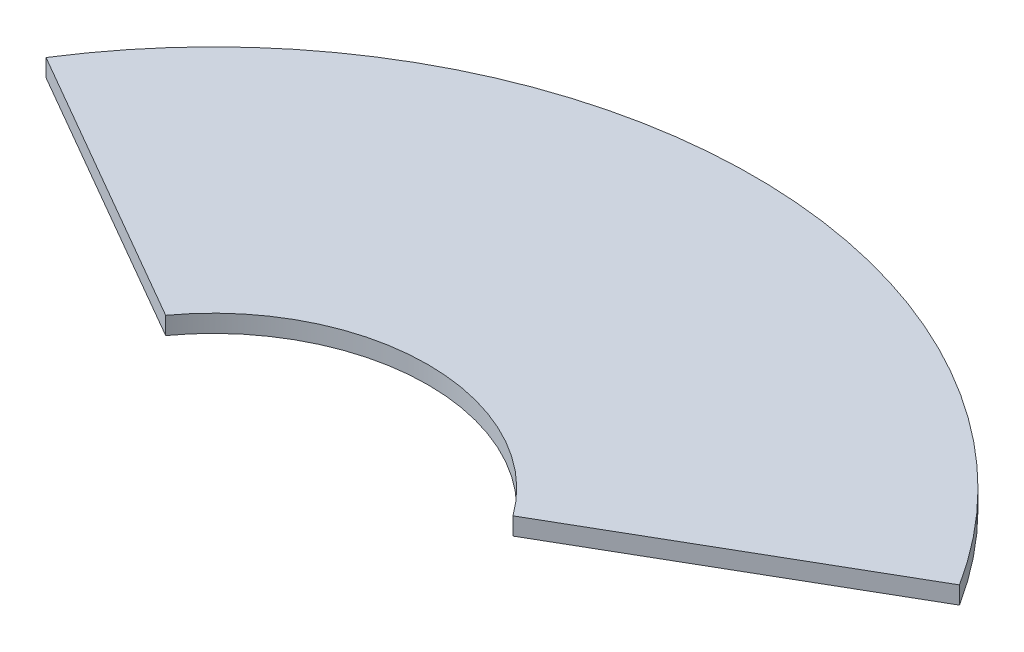
ISO-10303-21;
HEADER;
FILE_DESCRIPTION(('STEP AP214'),'2;1');
FILE_NAME('part.step','',(''),(''),'','','');
FILE_SCHEMA(('AUTOMOTIVE_DESIGN { 1 0 10303 214 1 1 1 1 }'));
ENDSEC;
DATA;
#1=APPLICATION_CONTEXT('core data for automotive mechanical design processes');
#2=APPLICATION_PROTOCOL_DEFINITION('international standard','automotive_design',2000,#1);
#3=PRODUCT_CONTEXT('',#1,'mechanical');
#4=PRODUCT('Part','Part','',(#3));
#5=PRODUCT_RELATED_PRODUCT_CATEGORY('part','',(#4));
#6=PRODUCT_DEFINITION_FORMATION('','',#4);
#7=PRODUCT_DEFINITION_CONTEXT('part definition',#1,'design');
#8=PRODUCT_DEFINITION('design','',#6,#7);
#9=PRODUCT_DEFINITION_SHAPE('','',#8);
#10=(LENGTH_UNIT() NAMED_UNIT(*) SI_UNIT(.MILLI.,.METRE.));
#11=(NAMED_UNIT(*) PLANE_ANGLE_UNIT() SI_UNIT($,.RADIAN.));
#12=(NAMED_UNIT(*) SI_UNIT($,.STERADIAN.) SOLID_ANGLE_UNIT());
#13=UNCERTAINTY_MEASURE_WITH_UNIT(LENGTH_MEASURE(1.E-05),#10,'distance_accuracy_value','');
#14=(GEOMETRIC_REPRESENTATION_CONTEXT(3) GLOBAL_UNCERTAINTY_ASSIGNED_CONTEXT((#13)) GLOBAL_UNIT_ASSIGNED_CONTEXT((#10,
#11,#12)) REPRESENTATION_CONTEXT('',''));
#15=CARTESIAN_POINT('',(0.,0.,0.));
#16=DIRECTION('',(0.,0.,1.));
#17=DIRECTION('',(1.,0.,0.));
#18=AXIS2_PLACEMENT_3D('',#15,#16,#17);
#19=CARTESIAN_POINT('',(11.,145.904708787959,-8.66025403784442));
#20=DIRECTION('',(0.981980506061966,0.,0.188982236504611));
#21=DIRECTION('',(0.188982236504611,0.,-0.981980506061966));
#22=AXIS2_PLACEMENT_3D('',#19,#20,#21);
#23=PLANE('',#22);
#24=DIRECTION('',(0.188982236504611,0.,-0.981980506061966));
#25=VECTOR('',#24,1.);
#26=CARTESIAN_POINT('',(11.,146.999,-8.66025403784442));
#27=LINE('',#26,#25);
#28=CARTESIAN_POINT('',(10.8461182539131,146.999,-7.86066103010504));
#29=VERTEX_POINT('',#28);
#30=CARTESIAN_POINT('',(10.8487709779865,146.999,-7.87444498872569));
#31=VERTEX_POINT('',#30);
#32=EDGE_CURVE('E112',#29,#31,#27,.T.);
#33=ORIENTED_EDGE('',*,*,#32,.F.);
#34=DIRECTION('',(0.,1.,0.));
#35=VECTOR('',#34,1.);
#36=CARTESIAN_POINT('',(10.8461182539131,145.904708787959,-7.86066103010504));
#37=LINE('',#36,#35);
#38=CARTESIAN_POINT('',(10.8461182539131,145.904708787959,-7.86066103010504));
#39=VERTEX_POINT('',#38);
#40=EDGE_CURVE('E32',#39,#29,#37,.T.);
#41=ORIENTED_EDGE('',*,*,#40,.F.);
#42=DIRECTION('',(0.188982236504611,0.,-0.981980506061966));
#43=VECTOR('',#42,1.);
#44=CARTESIAN_POINT('',(11.,145.904708787959,-8.66025403784442));
#45=LINE('',#44,#43);
#46=CARTESIAN_POINT('',(10.8487709779865,145.904708787959,-7.87444498872569));
#47=VERTEX_POINT('',#46);
#48=EDGE_CURVE('E132',#39,#47,#45,.T.);
#49=ORIENTED_EDGE('',*,*,#48,.T.);
#50=DIRECTION('',(0.,1.,0.));
#51=VECTOR('',#50,1.);
#52=CARTESIAN_POINT('',(10.8487709779865,145.904708787959,-7.87444498872569));
#53=LINE('',#52,#51);
#54=EDGE_CURVE('E10',#47,#31,#53,.T.);
#55=ORIENTED_EDGE('',*,*,#54,.T.);
#56=EDGE_LOOP('',(#33,#41,#49,#55));
#57=FACE_BOUND('',#56,.T.);
#58=ADVANCED_FACE('F16',(#57),#23,.T.);
#59=CARTESIAN_POINT('',(10.8487709779865,145.904708787959,-7.87444498872569));
#60=DIRECTION('',(0.500000000000004,0.,0.866025403784436));
#61=DIRECTION('',(0.866025403784436,0.,-0.500000000000004));
#62=AXIS2_PLACEMENT_3D('',#59,#60,#61);
#63=PLANE('',#62);
#64=DIRECTION('',(0.866025403784436,0.,-0.500000000000004));
#65=VECTOR('',#64,1.);
#66=CARTESIAN_POINT('',(10.8487709779865,146.999,-7.87444498872569));
#67=LINE('',#66,#65);
#68=CARTESIAN_POINT('',(28.5152924804553,146.999,-18.0742159338205));
#69=VERTEX_POINT('',#68);
#70=EDGE_CURVE('E115',#31,#69,#67,.T.);
#71=ORIENTED_EDGE('',*,*,#70,.F.);
#72=ORIENTED_EDGE('',*,*,#54,.F.);
#73=DIRECTION('',(0.866025403784436,0.,-0.500000000000004));
#74=VECTOR('',#73,1.);
#75=CARTESIAN_POINT('',(10.8487709779865,145.904708787959,-7.87444498872569));
#76=LINE('',#75,#74);
#77=CARTESIAN_POINT('',(28.5152924804553,145.904708787959,-18.0742159338205));
#78=VERTEX_POINT('',#77);
#79=EDGE_CURVE('E141',#47,#78,#76,.T.);
#80=ORIENTED_EDGE('',*,*,#79,.T.);
#81=DIRECTION('',(0.,1.,0.));
#82=VECTOR('',#81,1.);
#83=CARTESIAN_POINT('',(28.5152924804553,145.904708787959,-18.0742159338205));
#84=LINE('',#83,#82);
#85=EDGE_CURVE('E24',#78,#69,#84,.T.);
#86=ORIENTED_EDGE('',*,*,#85,.T.);
#87=EDGE_LOOP('',(#71,#72,#80,#86));
#88=FACE_BOUND('',#87,.T.);
#89=ADVANCED_FACE('F140',(#88),#63,.T.);
#90=CARTESIAN_POINT('',(28.5152924804554,145.904708787959,-18.0742159338205));
#91=DIRECTION('',(0.229549731573595,0.,-0.973296933486637));
#92=DIRECTION('',(-0.973296933486637,0.,-0.229549731573595));
#93=AXIS2_PLACEMENT_3D('',#90,#91,#92);
#94=PLANE('',#93);
#95=DIRECTION('',(-0.973296933486637,0.,-0.229549731573595));
#96=VECTOR('',#95,1.);
#97=CARTESIAN_POINT('',(28.5152924804554,146.999,-18.0742159338205));
#98=LINE('',#97,#96);
#99=CARTESIAN_POINT('',(28.5067781376292,146.999,-18.0762240210167));
#100=VERTEX_POINT('',#99);
#101=EDGE_CURVE('E118',#69,#100,#98,.T.);
#102=ORIENTED_EDGE('',*,*,#101,.F.);
#103=ORIENTED_EDGE('',*,*,#85,.F.);
#104=DIRECTION('',(-0.973296933486637,0.,-0.229549731573595));
#105=VECTOR('',#104,1.);
#106=CARTESIAN_POINT('',(28.5152924804554,145.904708787959,-18.0742159338205));
#107=LINE('',#106,#105);
#108=CARTESIAN_POINT('',(28.5067781376292,145.904708787959,-18.0762240210167));
#109=VERTEX_POINT('',#108);
#110=EDGE_CURVE('E150',#78,#109,#107,.T.);
#111=ORIENTED_EDGE('',*,*,#110,.T.);
#112=DIRECTION('',(0.,1.,0.));
#113=VECTOR('',#112,1.);
#114=CARTESIAN_POINT('',(28.5067781376292,145.904708787959,-18.0762240210167));
#115=LINE('',#114,#113);
#116=EDGE_CURVE('E138',#109,#100,#115,.T.);
#117=ORIENTED_EDGE('',*,*,#116,.T.);
#118=EDGE_LOOP('',(#102,#103,#111,#117));
#119=FACE_BOUND('',#118,.T.);
#120=ADVANCED_FACE('F145',(#119),#94,.T.);
#121=CARTESIAN_POINT('',(0.,145.904708787959,0.));
#122=DIRECTION('',(0.,1.,0.));
#123=DIRECTION('',(0.,0.,1.));
#124=AXIS2_PLACEMENT_3D('',#121,#122,#123);
#125=CYLINDRICAL_SURFACE('',#124,33.7547963206119);
#126=CARTESIAN_POINT('',(0.,146.999,0.));
#127=DIRECTION('',(0.,1.,0.));
#128=DIRECTION('',(0.844525259962001,0.,-0.535515718990689));
#129=AXIS2_PLACEMENT_3D('',#126,#127,#128);
#130=CIRCLE('',#129,33.7547963206119);
#131=CARTESIAN_POINT('',(-28.5067781376294,146.999,-18.0762240210163));
#132=VERTEX_POINT('',#131);
#133=EDGE_CURVE('E121',#100,#132,#130,.T.);
#134=ORIENTED_EDGE('',*,*,#133,.F.);
#135=ORIENTED_EDGE('',*,*,#116,.F.);
#136=CARTESIAN_POINT('',(0.,145.904708787959,0.));
#137=DIRECTION('',(0.,1.,0.));
#138=DIRECTION('',(0.844525259962001,0.,-0.535515718990689));
#139=AXIS2_PLACEMENT_3D('',#136,#137,#138);
#140=CIRCLE('',#139,33.7547963206119);
#141=CARTESIAN_POINT('',(-28.5067781376294,145.904708787959,-18.0762240210163));
#142=VERTEX_POINT('',#141);
#143=EDGE_CURVE('E154',#109,#142,#140,.T.);
#144=ORIENTED_EDGE('',*,*,#143,.T.);
#145=DIRECTION('',(0.,1.,0.));
#146=VECTOR('',#145,1.);
#147=CARTESIAN_POINT('',(-28.5067781376294,145.904708787959,-18.0762240210163));
#148=LINE('',#147,#146);
#149=EDGE_CURVE('E136',#142,#132,#148,.T.);
#150=ORIENTED_EDGE('',*,*,#149,.T.);
#151=EDGE_LOOP('',(#134,#135,#144,#150));
#152=FACE_BOUND('',#151,.T.);
#153=ADVANCED_FACE('F161',(#152),#125,.T.);
#154=CARTESIAN_POINT('',(-27.6563416990851,145.904708787959,-18.2767974015252));
#155=DIRECTION('',(-0.229549731573615,0.,-0.973296933486632));
#156=DIRECTION('',(-0.973296933486632,0.,0.229549731573615));
#157=AXIS2_PLACEMENT_3D('',#154,#155,#156);
#158=PLANE('',#157);
#159=DIRECTION('',(-0.973296933486632,0.,0.229549731573615));
#160=VECTOR('',#159,1.);
#161=CARTESIAN_POINT('',(-27.6563416990851,146.999,-18.2767974015252));
#162=LINE('',#161,#160);
#163=CARTESIAN_POINT('',(-28.5152924804556,146.999,-18.0742159338201));
#164=VERTEX_POINT('',#163);
#165=EDGE_CURVE('E124',#132,#164,#162,.T.);
#166=ORIENTED_EDGE('',*,*,#165,.F.);
#167=ORIENTED_EDGE('',*,*,#149,.F.);
#168=DIRECTION('',(-0.973296933486632,0.,0.229549731573615));
#169=VECTOR('',#168,1.);
#170=CARTESIAN_POINT('',(-27.6563416990851,145.904708787959,-18.2767974015252));
#171=LINE('',#170,#169);
#172=CARTESIAN_POINT('',(-28.5152924804556,145.904708787959,-18.0742159338201));
#173=VERTEX_POINT('',#172);
#174=EDGE_CURVE('E103',#142,#173,#171,.T.);
#175=ORIENTED_EDGE('',*,*,#174,.T.);
#176=DIRECTION('',(0.,1.,0.));
#177=VECTOR('',#176,1.);
#178=CARTESIAN_POINT('',(-28.5152924804556,145.904708787959,-18.0742159338201));
#179=LINE('',#178,#177);
#180=EDGE_CURVE('E95',#173,#164,#179,.T.);
#181=ORIENTED_EDGE('',*,*,#180,.T.);
#182=EDGE_LOOP('',(#166,#167,#175,#181));
#183=FACE_BOUND('',#182,.T.);
#184=ADVANCED_FACE('F158',(#183),#158,.T.);
#185=CARTESIAN_POINT('',(-28.5152924804556,145.904708787959,-18.0742159338201));
#186=DIRECTION('',(-0.499999999999992,0.,0.866025403784443));
#187=DIRECTION('',(0.866025403784444,0.,0.499999999999992));
#188=AXIS2_PLACEMENT_3D('',#185,#186,#187);
#189=PLANE('',#188);
#190=DIRECTION('',(0.866025403784443,0.,0.499999999999992));
#191=VECTOR('',#190,1.);
#192=CARTESIAN_POINT('',(-28.5152924804556,146.999,-18.0742159338201));
#193=LINE('',#192,#191);
#194=CARTESIAN_POINT('',(-10.8487709779866,146.999,-7.87444498872553));
#195=VERTEX_POINT('',#194);
#196=EDGE_CURVE('E127',#164,#195,#193,.T.);
#197=ORIENTED_EDGE('',*,*,#196,.F.);
#198=ORIENTED_EDGE('',*,*,#180,.F.);
#199=DIRECTION('',(0.866025403784443,0.,0.499999999999992));
#200=VECTOR('',#199,1.);
#201=CARTESIAN_POINT('',(-28.5152924804556,145.904708787959,-18.0742159338201));
#202=LINE('',#201,#200);
#203=CARTESIAN_POINT('',(-10.8487709779866,145.904708787959,-7.87444498872553));
#204=VERTEX_POINT('',#203);
#205=EDGE_CURVE('E98',#173,#204,#202,.T.);
#206=ORIENTED_EDGE('',*,*,#205,.T.);
#207=DIRECTION('',(0.,1.,0.));
#208=VECTOR('',#207,1.);
#209=CARTESIAN_POINT('',(-10.8487709779866,145.904708787959,-7.87444498872553));
#210=LINE('',#209,#208);
#211=EDGE_CURVE('E84',#204,#195,#210,.T.);
#212=ORIENTED_EDGE('',*,*,#211,.T.);
#213=EDGE_LOOP('',(#197,#198,#206,#212));
#214=FACE_BOUND('',#213,.T.);
#215=ADVANCED_FACE('F99',(#214),#189,.T.);
#216=CARTESIAN_POINT('',(-11.0000000000001,145.904708787959,-8.66025403784426));
#217=DIRECTION('',(-0.981980506061965,0.,0.188982236504619));
#218=DIRECTION('',(0.188982236504619,0.,0.981980506061965));
#219=AXIS2_PLACEMENT_3D('',#216,#217,#218);
#220=PLANE('',#219);
#221=DIRECTION('',(0.188982236504619,0.,0.981980506061965));
#222=VECTOR('',#221,1.);
#223=CARTESIAN_POINT('',(-11.0000000000001,146.999,-8.66025403784426));
#224=LINE('',#223,#222);
#225=CARTESIAN_POINT('',(-10.8461182539133,146.999,-7.86066103010488));
#226=VERTEX_POINT('',#225);
#227=EDGE_CURVE('E91',#195,#226,#224,.T.);
#228=ORIENTED_EDGE('',*,*,#227,.F.);
#229=ORIENTED_EDGE('',*,*,#211,.F.);
#230=DIRECTION('',(0.188982236504619,0.,0.981980506061965));
#231=VECTOR('',#230,1.);
#232=CARTESIAN_POINT('',(-11.0000000000001,145.904708787959,-8.66025403784426));
#233=LINE('',#232,#231);
#234=CARTESIAN_POINT('',(-10.8461182539133,145.904708787959,-7.86066103010488));
#235=VERTEX_POINT('',#234);
#236=EDGE_CURVE('E88',#204,#235,#233,.T.);
#237=ORIENTED_EDGE('',*,*,#236,.T.);
#238=DIRECTION('',(0.,1.,0.));
#239=VECTOR('',#238,1.);
#240=CARTESIAN_POINT('',(-10.8461182539133,145.904708787959,-7.86066103010488));
#241=LINE('',#240,#239);
#242=EDGE_CURVE('E60',#235,#226,#241,.T.);
#243=ORIENTED_EDGE('',*,*,#242,.T.);
#244=EDGE_LOOP('',(#228,#229,#237,#243));
#245=FACE_BOUND('',#244,.T.);
#246=ADVANCED_FACE('F86',(#245),#220,.T.);
#247=CARTESIAN_POINT('',(0.,145.904708787959,0.));
#248=DIRECTION('',(0.,1.,0.));
#249=DIRECTION('',(0.,0.,1.));
#250=AXIS2_PLACEMENT_3D('',#247,#248,#249);
#251=CYLINDRICAL_SURFACE('',#250,13.3950839119462);
#252=CARTESIAN_POINT('',(0.,146.999,0.));
#253=DIRECTION('',(0.,-1.,0.));
#254=DIRECTION('',(-0.809708869702586,0.,-0.586831787077831));
#255=AXIS2_PLACEMENT_3D('',#252,#253,#254);
#256=CIRCLE('',#255,13.3950839119462);
#257=EDGE_CURVE('E130',#226,#29,#256,.T.);
#258=ORIENTED_EDGE('',*,*,#257,.F.);
#259=ORIENTED_EDGE('',*,*,#242,.F.);
#260=CARTESIAN_POINT('',(0.,145.904708787959,0.));
#261=DIRECTION('',(0.,-1.,0.));
#262=DIRECTION('',(-0.809708869702586,0.,-0.586831787077831));
#263=AXIS2_PLACEMENT_3D('',#260,#261,#262);
#264=CIRCLE('',#263,13.3950839119462);
#265=EDGE_CURVE('E107',#235,#39,#264,.T.);
#266=ORIENTED_EDGE('',*,*,#265,.T.);
#267=ORIENTED_EDGE('',*,*,#40,.T.);
#268=EDGE_LOOP('',(#258,#259,#266,#267));
#269=FACE_BOUND('',#268,.T.);
#270=ADVANCED_FACE('F217',(#269),#251,.F.);
#271=CARTESIAN_POINT('',(0.,145.904708787959,-33.15));
#272=DIRECTION('',(0.,1.,0.));
#273=DIRECTION('',(-1.,0.,0.));
#274=AXIS2_PLACEMENT_3D('',#271,#272,#273);
#275=PLANE('',#274);
#276=ORIENTED_EDGE('',*,*,#48,.F.);
#277=ORIENTED_EDGE('',*,*,#265,.F.);
#278=ORIENTED_EDGE('',*,*,#236,.F.);
#279=ORIENTED_EDGE('',*,*,#205,.F.);
#280=ORIENTED_EDGE('',*,*,#174,.F.);
#281=ORIENTED_EDGE('',*,*,#143,.F.);
#282=ORIENTED_EDGE('',*,*,#110,.F.);
#283=ORIENTED_EDGE('',*,*,#79,.F.);
#284=EDGE_LOOP('',(#276,#277,#278,#279,#280,#281,#282,#283));
#285=FACE_BOUND('',#284,.T.);
#286=ADVANCED_FACE('F106',(#285),#275,.F.);
#287=CARTESIAN_POINT('',(0.,146.999,-33.15));
#288=DIRECTION('',(0.,1.,0.));
#289=DIRECTION('',(-1.,0.,0.));
#290=AXIS2_PLACEMENT_3D('',#287,#288,#289);
#291=PLANE('',#290);
#292=ORIENTED_EDGE('',*,*,#32,.T.);
#293=ORIENTED_EDGE('',*,*,#70,.T.);
#294=ORIENTED_EDGE('',*,*,#101,.T.);
#295=ORIENTED_EDGE('',*,*,#133,.T.);
#296=ORIENTED_EDGE('',*,*,#165,.T.);
#297=ORIENTED_EDGE('',*,*,#196,.T.);
#298=ORIENTED_EDGE('',*,*,#227,.T.);
#299=ORIENTED_EDGE('',*,*,#257,.T.);
#300=EDGE_LOOP('',(#292,#293,#294,#295,#296,#297,#298,#299));
#301=FACE_BOUND('',#300,.T.);
#302=ADVANCED_FACE('F148',(#301),#291,.T.);
#303=CLOSED_SHELL('',(#58,#89,#120,#153,#184,#215,#246,#270,#286,#302));
#304=MANIFOLD_SOLID_BREP('B1',#303);
#305=ADVANCED_BREP_SHAPE_REPRESENTATION('',(#18,#304),#14);
#306=SHAPE_DEFINITION_REPRESENTATION(#9,#305);
ENDSEC;
END-ISO-10303-21;
